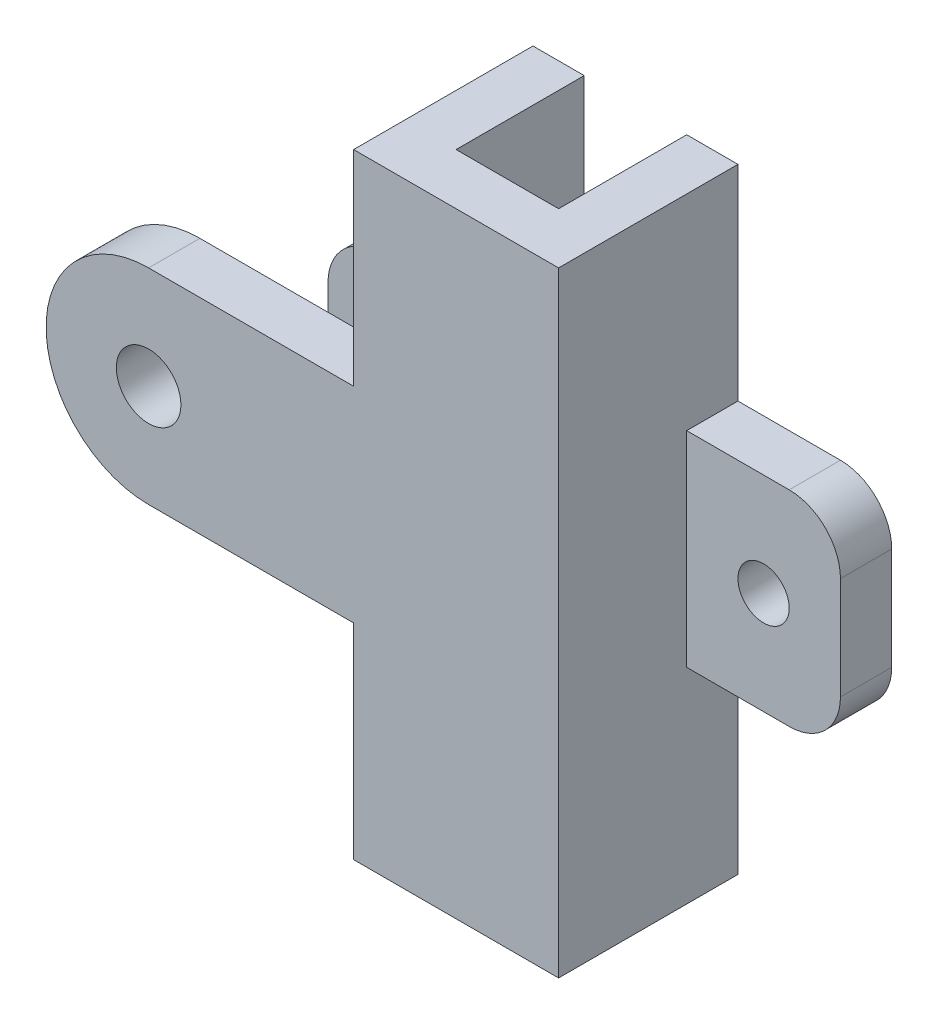
ISO-10303-21;
HEADER;
FILE_DESCRIPTION(('STEP AP214'),'2;1');
FILE_NAME('part.step','',(''),(''),'','','');
FILE_SCHEMA(('AUTOMOTIVE_DESIGN { 1 0 10303 214 1 1 1 1 }'));
ENDSEC;
DATA;
#1=APPLICATION_CONTEXT('core data for automotive mechanical design processes');
#2=APPLICATION_PROTOCOL_DEFINITION('international standard','automotive_design',2000,#1);
#3=PRODUCT_CONTEXT('',#1,'mechanical');
#4=PRODUCT('Part','Part','',(#3));
#5=PRODUCT_RELATED_PRODUCT_CATEGORY('part','',(#4));
#6=PRODUCT_DEFINITION_FORMATION('','',#4);
#7=PRODUCT_DEFINITION_CONTEXT('part definition',#1,'design');
#8=PRODUCT_DEFINITION('design','',#6,#7);
#9=PRODUCT_DEFINITION_SHAPE('','',#8);
#10=(LENGTH_UNIT() NAMED_UNIT(*) SI_UNIT(.MILLI.,.METRE.));
#11=(NAMED_UNIT(*) PLANE_ANGLE_UNIT() SI_UNIT($,.RADIAN.));
#12=(NAMED_UNIT(*) SI_UNIT($,.STERADIAN.) SOLID_ANGLE_UNIT());
#13=UNCERTAINTY_MEASURE_WITH_UNIT(LENGTH_MEASURE(1.E-05),#10,'distance_accuracy_value','');
#14=(GEOMETRIC_REPRESENTATION_CONTEXT(3) GLOBAL_UNCERTAINTY_ASSIGNED_CONTEXT((#13)) GLOBAL_UNIT_ASSIGNED_CONTEXT((#10,
#11,#12)) REPRESENTATION_CONTEXT('',''));
#15=CARTESIAN_POINT('',(0.,0.,0.));
#16=DIRECTION('',(0.,0.,1.));
#17=DIRECTION('',(1.,0.,0.));
#18=AXIS2_PLACEMENT_3D('',#15,#16,#17);
#19=CARTESIAN_POINT('',(25.4,76.2,0.));
#20=DIRECTION('',(-1.,0.,0.));
#21=DIRECTION('',(0.,0.,1.));
#22=AXIS2_PLACEMENT_3D('',#19,#20,#21);
#23=PLANE('',#22);
#24=DIRECTION('',(0.,0.,-1.));
#25=VECTOR('',#24,1.);
#26=CARTESIAN_POINT('',(25.4,25.4,-15.875));
#27=LINE('',#26,#25);
#28=CARTESIAN_POINT('',(25.4,25.4,-15.875));
#29=VERTEX_POINT('',#28);
#30=CARTESIAN_POINT('',(25.4,25.4,-22.225));
#31=VERTEX_POINT('',#30);
#32=EDGE_CURVE('E290',#29,#31,#27,.T.);
#33=ORIENTED_EDGE('',*,*,#32,.F.);
#34=DIRECTION('',(0.,1.,0.));
#35=VECTOR('',#34,1.);
#36=CARTESIAN_POINT('',(25.4,50.8,-15.875));
#37=LINE('',#36,#35);
#38=CARTESIAN_POINT('',(25.4,50.8,-15.875));
#39=VERTEX_POINT('',#38);
#40=EDGE_CURVE('E264',#29,#39,#37,.T.);
#41=ORIENTED_EDGE('',*,*,#40,.T.);
#42=DIRECTION('',(0.,0.,-1.));
#43=VECTOR('',#42,1.);
#44=CARTESIAN_POINT('',(25.4,50.8,-15.875));
#45=LINE('',#44,#43);
#46=CARTESIAN_POINT('',(25.4,50.8,-22.225));
#47=VERTEX_POINT('',#46);
#48=EDGE_CURVE('E280',#39,#47,#45,.T.);
#49=ORIENTED_EDGE('',*,*,#48,.T.);
#50=DIRECTION('',(0.,-1.,0.));
#51=VECTOR('',#50,1.);
#52=CARTESIAN_POINT('',(25.4,76.2,-22.225));
#53=LINE('',#52,#51);
#54=CARTESIAN_POINT('',(25.4,76.2,-22.225));
#55=VERTEX_POINT('',#54);
#56=EDGE_CURVE('E397',#55,#47,#53,.T.);
#57=ORIENTED_EDGE('',*,*,#56,.F.);
#58=DIRECTION('',(0.,0.,-1.));
#59=VECTOR('',#58,1.);
#60=CARTESIAN_POINT('',(25.4,76.2,0.));
#61=LINE('',#60,#59);
#62=CARTESIAN_POINT('',(25.4,76.2,0.));
#63=VERTEX_POINT('',#62);
#64=EDGE_CURVE('E368',#63,#55,#61,.T.);
#65=ORIENTED_EDGE('',*,*,#64,.F.);
#66=DIRECTION('',(0.,-1.,0.));
#67=VECTOR('',#66,1.);
#68=CARTESIAN_POINT('',(25.4,76.2,0.));
#69=LINE('',#68,#67);
#70=CARTESIAN_POINT('',(25.4,0.,0.));
#71=VERTEX_POINT('',#70);
#72=EDGE_CURVE('E401',#63,#71,#69,.T.);
#73=ORIENTED_EDGE('',*,*,#72,.T.);
#74=DIRECTION('',(0.,0.,-1.));
#75=VECTOR('',#74,1.);
#76=CARTESIAN_POINT('',(25.4,0.,0.));
#77=LINE('',#76,#75);
#78=CARTESIAN_POINT('',(25.4,0.,-22.225));
#79=VERTEX_POINT('',#78);
#80=EDGE_CURVE('E349',#71,#79,#77,.T.);
#81=ORIENTED_EDGE('',*,*,#80,.T.);
#82=EDGE_CURVE('E371',#31,#79,#53,.T.);
#83=ORIENTED_EDGE('',*,*,#82,.F.);
#84=EDGE_LOOP('',(#33,#41,#49,#57,#65,#73,#81,#83));
#85=FACE_BOUND('',#84,.T.);
#86=ADVANCED_FACE('F41',(#85),#23,.F.);
#87=CARTESIAN_POINT('',(0.,76.2,-22.225));
#88=DIRECTION('',(0.,0.,-1.));
#89=DIRECTION('',(-1.,0.,0.));
#90=AXIS2_PLACEMENT_3D('',#87,#88,#89);
#91=PLANE('',#90);
#92=DIRECTION('',(0.,-1.,0.));
#93=VECTOR('',#92,1.);
#94=CARTESIAN_POINT('',(44.45,50.8,-22.225));
#95=LINE('',#94,#93);
#96=CARTESIAN_POINT('',(44.45,44.45,-22.225));
#97=VERTEX_POINT('',#96);
#98=CARTESIAN_POINT('',(44.45,31.75,-22.225));
#99=VERTEX_POINT('',#98);
#100=EDGE_CURVE('E284',#97,#99,#95,.T.);
#101=ORIENTED_EDGE('',*,*,#100,.T.);
#102=CARTESIAN_POINT('',(38.1,31.75,-22.225));
#103=DIRECTION('',(0.,0.,-1.));
#104=DIRECTION('',(-1.,0.,0.));
#105=AXIS2_PLACEMENT_3D('',#102,#103,#104);
#106=CIRCLE('',#105,6.35);
#107=CARTESIAN_POINT('',(38.1,25.4,-22.225));
#108=VERTEX_POINT('',#107);
#109=EDGE_CURVE('E432',#99,#108,#106,.T.);
#110=ORIENTED_EDGE('',*,*,#109,.T.);
#111=DIRECTION('',(-1.,0.,0.));
#112=VECTOR('',#111,1.);
#113=CARTESIAN_POINT('',(25.4,25.4,-22.225));
#114=LINE('',#113,#112);
#115=EDGE_CURVE('E269',#108,#31,#114,.T.);
#116=ORIENTED_EDGE('',*,*,#115,.T.);
#117=ORIENTED_EDGE('',*,*,#82,.T.);
#118=DIRECTION('',(1.,0.,0.));
#119=VECTOR('',#118,1.);
#120=CARTESIAN_POINT('',(0.,0.,-22.225));
#121=LINE('',#120,#119);
#122=CARTESIAN_POINT('',(19.05,0.,-22.225));
#123=VERTEX_POINT('',#122);
#124=EDGE_CURVE('E343',#123,#79,#121,.T.);
#125=ORIENTED_EDGE('',*,*,#124,.F.);
#126=DIRECTION('',(0.,-1.,0.));
#127=VECTOR('',#126,1.);
#128=CARTESIAN_POINT('',(19.05,76.2,-22.225));
#129=LINE('',#128,#127);
#130=CARTESIAN_POINT('',(19.05,76.2,-22.225));
#131=VERTEX_POINT('',#130);
#132=EDGE_CURVE('E419',#131,#123,#129,.T.);
#133=ORIENTED_EDGE('',*,*,#132,.F.);
#134=DIRECTION('',(1.,0.,0.));
#135=VECTOR('',#134,1.);
#136=CARTESIAN_POINT('',(0.,76.2,-22.225));
#137=LINE('',#136,#135);
#138=EDGE_CURVE('E344',#131,#55,#137,.T.);
#139=ORIENTED_EDGE('',*,*,#138,.T.);
#140=ORIENTED_EDGE('',*,*,#56,.T.);
#141=DIRECTION('',(1.,0.,0.));
#142=VECTOR('',#141,1.);
#143=CARTESIAN_POINT('',(25.4,50.8,-22.225));
#144=LINE('',#143,#142);
#145=CARTESIAN_POINT('',(38.1,50.8,-22.225));
#146=VERTEX_POINT('',#145);
#147=EDGE_CURVE('E260',#47,#146,#144,.T.);
#148=ORIENTED_EDGE('',*,*,#147,.T.);
#149=CARTESIAN_POINT('',(38.1,44.45,-22.225));
#150=DIRECTION('',(0.,0.,-1.));
#151=DIRECTION('',(-1.,0.,0.));
#152=AXIS2_PLACEMENT_3D('',#149,#150,#151);
#153=CIRCLE('',#152,6.35);
#154=EDGE_CURVE('E429',#146,#97,#153,.T.);
#155=ORIENTED_EDGE('',*,*,#154,.T.);
#156=EDGE_LOOP('',(#101,#110,#116,#117,#125,#133,#139,#140,#148,#155));
#157=FACE_BOUND('',#156,.T.);
#158=CARTESIAN_POINT('',(34.925,38.1,-22.225));
#159=DIRECTION('',(0.,0.,-1.));
#160=DIRECTION('',(-1.,0.,0.));
#161=AXIS2_PLACEMENT_3D('',#158,#159,#160);
#162=CIRCLE('',#161,3.175);
#163=CARTESIAN_POINT('',(31.75,38.1,-22.225));
#164=VERTEX_POINT('',#163);
#165=EDGE_CURVE('E254',#164,#164,#162,.T.);
#166=ORIENTED_EDGE('',*,*,#165,.F.);
#167=EDGE_LOOP('',(#166));
#168=FACE_BOUND('',#167,.T.);
#169=ADVANCED_FACE('F540',(#157,#168),#91,.T.);
#170=CARTESIAN_POINT('',(19.05,76.2,0.));
#171=DIRECTION('',(1.,0.,0.));
#172=DIRECTION('',(0.,0.,-1.));
#173=AXIS2_PLACEMENT_3D('',#170,#171,#172);
#174=PLANE('',#173);
#175=DIRECTION('',(0.,0.,1.));
#176=VECTOR('',#175,1.);
#177=CARTESIAN_POINT('',(19.05,0.,0.));
#178=LINE('',#177,#176);
#179=CARTESIAN_POINT('',(19.05,0.,-6.35));
#180=VERTEX_POINT('',#179);
#181=EDGE_CURVE('E375',#123,#180,#178,.T.);
#182=ORIENTED_EDGE('',*,*,#181,.T.);
#183=DIRECTION('',(0.,-1.,0.));
#184=VECTOR('',#183,1.);
#185=CARTESIAN_POINT('',(19.05,76.2,-6.35));
#186=LINE('',#185,#184);
#187=CARTESIAN_POINT('',(19.05,76.2,-6.35));
#188=VERTEX_POINT('',#187);
#189=EDGE_CURVE('E416',#188,#180,#186,.T.);
#190=ORIENTED_EDGE('',*,*,#189,.F.);
#191=DIRECTION('',(0.,0.,1.));
#192=VECTOR('',#191,1.);
#193=CARTESIAN_POINT('',(19.05,76.2,0.));
#194=LINE('',#193,#192);
#195=EDGE_CURVE('E348',#131,#188,#194,.T.);
#196=ORIENTED_EDGE('',*,*,#195,.F.);
#197=ORIENTED_EDGE('',*,*,#132,.T.);
#198=EDGE_LOOP('',(#182,#190,#196,#197));
#199=FACE_BOUND('',#198,.T.);
#200=ADVANCED_FACE('F545',(#199),#174,.F.);
#201=CARTESIAN_POINT('',(0.,76.2,-6.35));
#202=DIRECTION('',(0.,0.,-1.));
#203=DIRECTION('',(-1.,0.,0.));
#204=AXIS2_PLACEMENT_3D('',#201,#202,#203);
#205=PLANE('',#204);
#206=ORIENTED_EDGE('',*,*,#189,.T.);
#207=DIRECTION('',(1.,0.,0.));
#208=VECTOR('',#207,1.);
#209=CARTESIAN_POINT('',(0.,0.,-6.35));
#210=LINE('',#209,#208);
#211=CARTESIAN_POINT('',(6.35,0.,-6.35));
#212=VERTEX_POINT('',#211);
#213=EDGE_CURVE('E379',#212,#180,#210,.T.);
#214=ORIENTED_EDGE('',*,*,#213,.F.);
#215=DIRECTION('',(0.,-1.,0.));
#216=VECTOR('',#215,1.);
#217=CARTESIAN_POINT('',(6.35,76.2,-6.35));
#218=LINE('',#217,#216);
#219=CARTESIAN_POINT('',(6.35,76.2,-6.35));
#220=VERTEX_POINT('',#219);
#221=EDGE_CURVE('E413',#220,#212,#218,.T.);
#222=ORIENTED_EDGE('',*,*,#221,.F.);
#223=DIRECTION('',(1.,0.,0.));
#224=VECTOR('',#223,1.);
#225=CARTESIAN_POINT('',(0.,76.2,-6.35));
#226=LINE('',#225,#224);
#227=EDGE_CURVE('E353',#220,#188,#226,.T.);
#228=ORIENTED_EDGE('',*,*,#227,.T.);
#229=EDGE_LOOP('',(#206,#214,#222,#228));
#230=FACE_BOUND('',#229,.T.);
#231=ADVANCED_FACE('F558',(#230),#205,.T.);
#232=CARTESIAN_POINT('',(6.35,76.2,0.));
#233=DIRECTION('',(1.,0.,0.));
#234=DIRECTION('',(0.,0.,-1.));
#235=AXIS2_PLACEMENT_3D('',#232,#233,#234);
#236=PLANE('',#235);
#237=DIRECTION('',(0.,0.,1.));
#238=VECTOR('',#237,1.);
#239=CARTESIAN_POINT('',(6.35,0.,0.));
#240=LINE('',#239,#238);
#241=CARTESIAN_POINT('',(6.35,0.,-22.225));
#242=VERTEX_POINT('',#241);
#243=EDGE_CURVE('E383',#242,#212,#240,.T.);
#244=ORIENTED_EDGE('',*,*,#243,.F.);
#245=DIRECTION('',(0.,-1.,0.));
#246=VECTOR('',#245,1.);
#247=CARTESIAN_POINT('',(6.35,76.2,-22.225));
#248=LINE('',#247,#246);
#249=CARTESIAN_POINT('',(6.35,76.2,-22.225));
#250=VERTEX_POINT('',#249);
#251=EDGE_CURVE('E410',#250,#242,#248,.T.);
#252=ORIENTED_EDGE('',*,*,#251,.F.);
#253=DIRECTION('',(0.,0.,1.));
#254=VECTOR('',#253,1.);
#255=CARTESIAN_POINT('',(6.35,76.2,0.));
#256=LINE('',#255,#254);
#257=EDGE_CURVE('E357',#250,#220,#256,.T.);
#258=ORIENTED_EDGE('',*,*,#257,.T.);
#259=ORIENTED_EDGE('',*,*,#221,.T.);
#260=EDGE_LOOP('',(#244,#252,#258,#259));
#261=FACE_BOUND('',#260,.T.);
#262=ADVANCED_FACE('F555',(#261),#236,.T.);
#263=DIRECTION('',(-1.,0.,0.));
#264=VECTOR('',#263,1.);
#265=CARTESIAN_POINT('',(0.,25.4,-22.225));
#266=LINE('',#265,#264);
#267=CARTESIAN_POINT('',(0.,25.4,-22.225));
#268=VERTEX_POINT('',#267);
#269=CARTESIAN_POINT('',(-12.7,25.4,-22.225));
#270=VERTEX_POINT('',#269);
#271=EDGE_CURVE('E208',#268,#270,#266,.T.);
#272=ORIENTED_EDGE('',*,*,#271,.T.);
#273=CARTESIAN_POINT('',(-12.7,31.75,-22.225));
#274=DIRECTION('',(0.,0.,-1.));
#275=DIRECTION('',(-1.,0.,0.));
#276=AXIS2_PLACEMENT_3D('',#273,#274,#275);
#277=CIRCLE('',#276,6.35);
#278=CARTESIAN_POINT('',(-19.05,31.75,-22.225));
#279=VERTEX_POINT('',#278);
#280=EDGE_CURVE('E453',#270,#279,#277,.T.);
#281=ORIENTED_EDGE('',*,*,#280,.T.);
#282=DIRECTION('',(0.,1.,0.));
#283=VECTOR('',#282,1.);
#284=CARTESIAN_POINT('',(-19.05,50.8,-22.225));
#285=LINE('',#284,#283);
#286=CARTESIAN_POINT('',(-19.05,44.45,-22.225));
#287=VERTEX_POINT('',#286);
#288=EDGE_CURVE('E236',#279,#287,#285,.T.);
#289=ORIENTED_EDGE('',*,*,#288,.T.);
#290=CARTESIAN_POINT('',(-12.7,44.45,-22.225));
#291=DIRECTION('',(0.,0.,-1.));
#292=DIRECTION('',(-1.,0.,0.));
#293=AXIS2_PLACEMENT_3D('',#290,#291,#292);
#294=CIRCLE('',#293,6.35);
#295=CARTESIAN_POINT('',(-12.7,50.8,-22.225));
#296=VERTEX_POINT('',#295);
#297=EDGE_CURVE('E450',#287,#296,#294,.T.);
#298=ORIENTED_EDGE('',*,*,#297,.T.);
#299=DIRECTION('',(1.,0.,0.));
#300=VECTOR('',#299,1.);
#301=CARTESIAN_POINT('',(0.,50.8,-22.225));
#302=LINE('',#301,#300);
#303=CARTESIAN_POINT('',(0.,50.8,-22.225));
#304=VERTEX_POINT('',#303);
#305=EDGE_CURVE('E242',#296,#304,#302,.T.);
#306=ORIENTED_EDGE('',*,*,#305,.T.);
#307=DIRECTION('',(0.,-1.,0.));
#308=VECTOR('',#307,1.);
#309=CARTESIAN_POINT('',(0.,76.2,-22.225));
#310=LINE('',#309,#308);
#311=CARTESIAN_POINT('',(0.,76.2,-22.225));
#312=VERTEX_POINT('',#311);
#313=EDGE_CURVE('E215',#312,#304,#310,.T.);
#314=ORIENTED_EDGE('',*,*,#313,.F.);
#315=EDGE_CURVE('E350',#312,#250,#137,.T.);
#316=ORIENTED_EDGE('',*,*,#315,.T.);
#317=ORIENTED_EDGE('',*,*,#251,.T.);
#318=CARTESIAN_POINT('',(0.,0.,-22.225));
#319=VERTEX_POINT('',#318);
#320=EDGE_CURVE('E210',#319,#242,#121,.T.);
#321=ORIENTED_EDGE('',*,*,#320,.F.);
#322=EDGE_CURVE('E203',#268,#319,#310,.T.);
#323=ORIENTED_EDGE('',*,*,#322,.F.);
#324=EDGE_LOOP('',(#272,#281,#289,#298,#306,#314,#316,#317,#321,#323));
#325=FACE_BOUND('',#324,.T.);
#326=CARTESIAN_POINT('',(-9.52500000000001,38.1,-22.225));
#327=DIRECTION('',(0.,0.,-1.));
#328=DIRECTION('',(1.,0.,0.));
#329=AXIS2_PLACEMENT_3D('',#326,#327,#328);
#330=CIRCLE('',#329,3.175);
#331=CARTESIAN_POINT('',(-6.35000000000001,38.1,-22.225));
#332=VERTEX_POINT('',#331);
#333=EDGE_CURVE('E245',#332,#332,#330,.T.);
#334=ORIENTED_EDGE('',*,*,#333,.F.);
#335=EDGE_LOOP('',(#334));
#336=FACE_BOUND('',#335,.T.);
#337=ADVANCED_FACE('F205',(#325,#336),#91,.T.);
#338=CARTESIAN_POINT('',(0.,76.2,0.));
#339=DIRECTION('',(-1.,0.,0.));
#340=DIRECTION('',(0.,0.,1.));
#341=AXIS2_PLACEMENT_3D('',#338,#339,#340);
#342=PLANE('',#341);
#343=DIRECTION('',(0.,0.,-1.));
#344=VECTOR('',#343,1.);
#345=CARTESIAN_POINT('',(0.,50.8,-15.875));
#346=LINE('',#345,#344);
#347=CARTESIAN_POINT('',(0.,50.8,-15.875));
#348=VERTEX_POINT('',#347);
#349=EDGE_CURVE('E228',#348,#304,#346,.T.);
#350=ORIENTED_EDGE('',*,*,#349,.F.);
#351=DIRECTION('',(0.,-1.,0.));
#352=VECTOR('',#351,1.);
#353=CARTESIAN_POINT('',(0.,50.8,-15.875));
#354=LINE('',#353,#352);
#355=CARTESIAN_POINT('',(0.,25.4,-15.875));
#356=VERTEX_POINT('',#355);
#357=EDGE_CURVE('E223',#348,#356,#354,.T.);
#358=ORIENTED_EDGE('',*,*,#357,.T.);
#359=DIRECTION('',(0.,0.,-1.));
#360=VECTOR('',#359,1.);
#361=CARTESIAN_POINT('',(0.,25.4,-15.875));
#362=LINE('',#361,#360);
#363=EDGE_CURVE('E219',#356,#268,#362,.T.);
#364=ORIENTED_EDGE('',*,*,#363,.T.);
#365=ORIENTED_EDGE('',*,*,#322,.T.);
#366=DIRECTION('',(0.,0.,-1.));
#367=VECTOR('',#366,1.);
#368=CARTESIAN_POINT('',(0.,0.,0.));
#369=LINE('',#368,#367);
#370=CARTESIAN_POINT('',(0.,0.,0.));
#371=VERTEX_POINT('',#370);
#372=EDGE_CURVE('E387',#371,#319,#369,.T.);
#373=ORIENTED_EDGE('',*,*,#372,.F.);
#374=DIRECTION('',(0.,-1.,0.));
#375=VECTOR('',#374,1.);
#376=CARTESIAN_POINT('',(0.,76.2,0.));
#377=LINE('',#376,#375);
#378=CARTESIAN_POINT('',(0.,25.4,0.));
#379=VERTEX_POINT('',#378);
#380=EDGE_CURVE('E404',#379,#371,#377,.T.);
#381=ORIENTED_EDGE('',*,*,#380,.F.);
#382=DIRECTION('',(0.,0.,1.));
#383=VECTOR('',#382,1.);
#384=CARTESIAN_POINT('',(0.,25.4,0.));
#385=LINE('',#384,#383);
#386=CARTESIAN_POINT('',(0.,25.4,-6.35));
#387=VERTEX_POINT('',#386);
#388=EDGE_CURVE('E339',#387,#379,#385,.T.);
#389=ORIENTED_EDGE('',*,*,#388,.F.);
#390=DIRECTION('',(0.,-1.,0.));
#391=VECTOR('',#390,1.);
#392=CARTESIAN_POINT('',(0.,76.2,-6.35));
#393=LINE('',#392,#391);
#394=CARTESIAN_POINT('',(0.,50.8,-6.35));
#395=VERTEX_POINT('',#394);
#396=EDGE_CURVE('E330',#395,#387,#393,.T.);
#397=ORIENTED_EDGE('',*,*,#396,.F.);
#398=DIRECTION('',(0.,0.,-1.));
#399=VECTOR('',#398,1.);
#400=CARTESIAN_POINT('',(0.,50.8,0.));
#401=LINE('',#400,#399);
#402=CARTESIAN_POINT('',(0.,50.8,0.));
#403=VERTEX_POINT('',#402);
#404=EDGE_CURVE('E336',#403,#395,#401,.T.);
#405=ORIENTED_EDGE('',*,*,#404,.F.);
#406=CARTESIAN_POINT('',(0.,76.2,0.));
#407=VERTEX_POINT('',#406);
#408=EDGE_CURVE('E216',#407,#403,#377,.T.);
#409=ORIENTED_EDGE('',*,*,#408,.F.);
#410=DIRECTION('',(0.,0.,-1.));
#411=VECTOR('',#410,1.);
#412=CARTESIAN_POINT('',(0.,76.2,0.));
#413=LINE('',#412,#411);
#414=EDGE_CURVE('E361',#407,#312,#413,.T.);
#415=ORIENTED_EDGE('',*,*,#414,.T.);
#416=ORIENTED_EDGE('',*,*,#313,.T.);
#417=EDGE_LOOP('',(#350,#358,#364,#365,#373,#381,#389,#397,#405,#409,#415,#416));
#418=FACE_BOUND('',#417,.T.);
#419=ADVANCED_FACE('F221',(#418),#342,.T.);
#420=CARTESIAN_POINT('',(0.,76.2,0.));
#421=DIRECTION('',(0.,0.,-1.));
#422=DIRECTION('',(-1.,0.,0.));
#423=AXIS2_PLACEMENT_3D('',#420,#421,#422);
#424=PLANE('',#423);
#425=DIRECTION('',(1.,0.,0.));
#426=VECTOR('',#425,1.);
#427=CARTESIAN_POINT('',(0.,0.,0.));
#428=LINE('',#427,#426);
#429=EDGE_CURVE('E390',#371,#71,#428,.T.);
#430=ORIENTED_EDGE('',*,*,#429,.T.);
#431=ORIENTED_EDGE('',*,*,#72,.F.);
#432=DIRECTION('',(1.,0.,0.));
#433=VECTOR('',#432,1.);
#434=CARTESIAN_POINT('',(0.,76.2,0.));
#435=LINE('',#434,#433);
#436=EDGE_CURVE('E365',#407,#63,#435,.T.);
#437=ORIENTED_EDGE('',*,*,#436,.F.);
#438=ORIENTED_EDGE('',*,*,#408,.T.);
#439=DIRECTION('',(-1.,0.,0.));
#440=VECTOR('',#439,1.);
#441=CARTESIAN_POINT('',(12.7,50.8,0.));
#442=LINE('',#441,#440);
#443=CARTESIAN_POINT('',(-25.4,50.8,0.));
#444=VERTEX_POINT('',#443);
#445=EDGE_CURVE('E302',#403,#444,#442,.T.);
#446=ORIENTED_EDGE('',*,*,#445,.T.);
#447=CARTESIAN_POINT('',(-25.4,38.1,0.));
#448=DIRECTION('',(0.,0.,1.));
#449=DIRECTION('',(1.,0.,0.));
#450=AXIS2_PLACEMENT_3D('',#447,#448,#449);
#451=CIRCLE('',#450,12.7);
#452=CARTESIAN_POINT('',(-25.4,25.4,0.));
#453=VERTEX_POINT('',#452);
#454=EDGE_CURVE('E321',#444,#453,#451,.T.);
#455=ORIENTED_EDGE('',*,*,#454,.T.);
#456=DIRECTION('',(1.,0.,0.));
#457=VECTOR('',#456,1.);
#458=CARTESIAN_POINT('',(-25.4,25.4,0.));
#459=LINE('',#458,#457);
#460=EDGE_CURVE('E310',#453,#379,#459,.T.);
#461=ORIENTED_EDGE('',*,*,#460,.T.);
#462=ORIENTED_EDGE('',*,*,#380,.T.);
#463=EDGE_LOOP('',(#430,#431,#437,#438,#446,#455,#461,#462));
#464=FACE_BOUND('',#463,.T.);
#465=CARTESIAN_POINT('',(-25.4,38.1,0.));
#466=DIRECTION('',(0.,0.,1.));
#467=DIRECTION('',(1.,0.,0.));
#468=AXIS2_PLACEMENT_3D('',#465,#466,#467);
#469=CIRCLE('',#468,4.0005);
#470=CARTESIAN_POINT('',(-21.3995,38.1,0.));
#471=VERTEX_POINT('',#470);
#472=EDGE_CURVE('E294',#471,#471,#469,.T.);
#473=ORIENTED_EDGE('',*,*,#472,.F.);
#474=EDGE_LOOP('',(#473));
#475=FACE_BOUND('',#474,.T.);
#476=ADVANCED_FACE('F493',(#464,#475),#424,.F.);
#477=CARTESIAN_POINT('',(0.,76.2,0.));
#478=DIRECTION('',(0.,1.,0.));
#479=DIRECTION('',(0.,0.,1.));
#480=AXIS2_PLACEMENT_3D('',#477,#478,#479);
#481=PLANE('',#480);
#482=ORIENTED_EDGE('',*,*,#138,.F.);
#483=ORIENTED_EDGE('',*,*,#195,.T.);
#484=ORIENTED_EDGE('',*,*,#227,.F.);
#485=ORIENTED_EDGE('',*,*,#257,.F.);
#486=ORIENTED_EDGE('',*,*,#315,.F.);
#487=ORIENTED_EDGE('',*,*,#414,.F.);
#488=ORIENTED_EDGE('',*,*,#436,.T.);
#489=ORIENTED_EDGE('',*,*,#64,.T.);
#490=EDGE_LOOP('',(#482,#483,#484,#485,#486,#487,#488,#489));
#491=FACE_BOUND('',#490,.T.);
#492=ADVANCED_FACE('F513',(#491),#481,.T.);
#493=CARTESIAN_POINT('',(0.,0.,0.));
#494=DIRECTION('',(0.,1.,0.));
#495=DIRECTION('',(0.,0.,1.));
#496=AXIS2_PLACEMENT_3D('',#493,#494,#495);
#497=PLANE('',#496);
#498=ORIENTED_EDGE('',*,*,#124,.T.);
#499=ORIENTED_EDGE('',*,*,#80,.F.);
#500=ORIENTED_EDGE('',*,*,#429,.F.);
#501=ORIENTED_EDGE('',*,*,#372,.T.);
#502=ORIENTED_EDGE('',*,*,#320,.T.);
#503=ORIENTED_EDGE('',*,*,#243,.T.);
#504=ORIENTED_EDGE('',*,*,#213,.T.);
#505=ORIENTED_EDGE('',*,*,#181,.F.);
#506=EDGE_LOOP('',(#498,#499,#500,#501,#502,#503,#504,#505));
#507=FACE_BOUND('',#506,.T.);
#508=ADVANCED_FACE('F500',(#507),#497,.F.);
#509=CARTESIAN_POINT('',(-25.4,25.4,-6.35));
#510=DIRECTION('',(0.,-1.,0.));
#511=DIRECTION('',(1.,0.,0.));
#512=AXIS2_PLACEMENT_3D('',#509,#510,#511);
#513=PLANE('',#512);
#514=DIRECTION('',(1.,0.,0.));
#515=VECTOR('',#514,1.);
#516=CARTESIAN_POINT('',(-25.4,25.4,-6.35));
#517=LINE('',#516,#515);
#518=CARTESIAN_POINT('',(-25.4,25.4,-6.35));
#519=VERTEX_POINT('',#518);
#520=EDGE_CURVE('E314',#519,#387,#517,.T.);
#521=ORIENTED_EDGE('',*,*,#520,.T.);
#522=ORIENTED_EDGE('',*,*,#388,.T.);
#523=ORIENTED_EDGE('',*,*,#460,.F.);
#524=DIRECTION('',(0.,0.,1.));
#525=VECTOR('',#524,1.);
#526=CARTESIAN_POINT('',(-25.4,25.4,-6.35));
#527=LINE('',#526,#525);
#528=EDGE_CURVE('E327',#519,#453,#527,.T.);
#529=ORIENTED_EDGE('',*,*,#528,.F.);
#530=EDGE_LOOP('',(#521,#522,#523,#529));
#531=FACE_BOUND('',#530,.T.);
#532=ADVANCED_FACE('F529',(#531),#513,.T.);
#533=CARTESIAN_POINT('',(-25.4,38.1,-6.35));
#534=DIRECTION('',(0.,0.,1.));
#535=DIRECTION('',(1.,0.,0.));
#536=AXIS2_PLACEMENT_3D('',#533,#534,#535);
#537=CYLINDRICAL_SURFACE('',#536,12.7);
#538=ORIENTED_EDGE('',*,*,#454,.F.);
#539=DIRECTION('',(0.,0.,1.));
#540=VECTOR('',#539,1.);
#541=CARTESIAN_POINT('',(-25.4,50.8,-6.35));
#542=LINE('',#541,#540);
#543=CARTESIAN_POINT('',(-25.4,50.8,-6.35));
#544=VERTEX_POINT('',#543);
#545=EDGE_CURVE('E318',#544,#444,#542,.T.);
#546=ORIENTED_EDGE('',*,*,#545,.F.);
#547=CARTESIAN_POINT('',(-25.4,38.1,-6.35));
#548=DIRECTION('',(0.,0.,1.));
#549=DIRECTION('',(1.,0.,0.));
#550=AXIS2_PLACEMENT_3D('',#547,#548,#549);
#551=CIRCLE('',#550,12.7);
#552=EDGE_CURVE('E309',#544,#519,#551,.T.);
#553=ORIENTED_EDGE('',*,*,#552,.T.);
#554=ORIENTED_EDGE('',*,*,#528,.T.);
#555=EDGE_LOOP('',(#538,#546,#553,#554));
#556=FACE_BOUND('',#555,.T.);
#557=ADVANCED_FACE('F527',(#556),#537,.T.);
#558=CARTESIAN_POINT('',(12.7,50.8,-6.35));
#559=DIRECTION('',(0.,1.,0.));
#560=DIRECTION('',(-1.,0.,0.));
#561=AXIS2_PLACEMENT_3D('',#558,#559,#560);
#562=PLANE('',#561);
#563=ORIENTED_EDGE('',*,*,#445,.F.);
#564=ORIENTED_EDGE('',*,*,#404,.T.);
#565=DIRECTION('',(-1.,0.,0.));
#566=VECTOR('',#565,1.);
#567=CARTESIAN_POINT('',(12.7,50.8,-6.35));
#568=LINE('',#567,#566);
#569=EDGE_CURVE('E306',#395,#544,#568,.T.);
#570=ORIENTED_EDGE('',*,*,#569,.T.);
#571=ORIENTED_EDGE('',*,*,#545,.T.);
#572=EDGE_LOOP('',(#563,#564,#570,#571));
#573=FACE_BOUND('',#572,.T.);
#574=ADVANCED_FACE('F519',(#573),#562,.T.);
#575=CARTESIAN_POINT('',(12.7,38.1,-6.35));
#576=DIRECTION('',(0.,0.,-1.));
#577=DIRECTION('',(-1.,0.,0.));
#578=AXIS2_PLACEMENT_3D('',#575,#576,#577);
#579=PLANE('',#578);
#580=CARTESIAN_POINT('',(-25.4,38.1,-6.35));
#581=DIRECTION('',(0.,0.,1.));
#582=DIRECTION('',(1.,0.,0.));
#583=AXIS2_PLACEMENT_3D('',#580,#581,#582);
#584=CIRCLE('',#583,4.0005);
#585=CARTESIAN_POINT('',(-21.3995,38.1,-6.35));
#586=VERTEX_POINT('',#585);
#587=EDGE_CURVE('E298',#586,#586,#584,.T.);
#588=ORIENTED_EDGE('',*,*,#587,.T.);
#589=EDGE_LOOP('',(#588));
#590=FACE_BOUND('',#589,.T.);
#591=ORIENTED_EDGE('',*,*,#569,.F.);
#592=ORIENTED_EDGE('',*,*,#396,.T.);
#593=ORIENTED_EDGE('',*,*,#520,.F.);
#594=ORIENTED_EDGE('',*,*,#552,.F.);
#595=EDGE_LOOP('',(#591,#592,#593,#594));
#596=FACE_BOUND('',#595,.T.);
#597=ADVANCED_FACE('F523',(#590,#596),#579,.T.);
#598=CARTESIAN_POINT('',(-25.4,38.1,-6.35));
#599=DIRECTION('',(0.,0.,1.));
#600=DIRECTION('',(1.,0.,0.));
#601=AXIS2_PLACEMENT_3D('',#598,#599,#600);
#602=CYLINDRICAL_SURFACE('',#601,4.0005);
#603=ORIENTED_EDGE('',*,*,#587,.F.);
#604=EDGE_LOOP('',(#603));
#605=FACE_BOUND('',#604,.T.);
#606=ORIENTED_EDGE('',*,*,#472,.T.);
#607=EDGE_LOOP('',(#606));
#608=FACE_BOUND('',#607,.T.);
#609=ADVANCED_FACE('F674',(#605,#608),#602,.F.);
#610=CARTESIAN_POINT('',(25.4,25.4,-15.875));
#611=DIRECTION('',(0.,-1.,0.));
#612=DIRECTION('',(0.,0.,-1.));
#613=AXIS2_PLACEMENT_3D('',#610,#611,#612);
#614=PLANE('',#613);
#615=ORIENTED_EDGE('',*,*,#115,.F.);
#616=DIRECTION('',(0.,0.,-1.));
#617=VECTOR('',#616,1.);
#618=CARTESIAN_POINT('',(38.1,25.4,-15.875));
#619=LINE('',#618,#617);
#620=CARTESIAN_POINT('',(38.1,25.4,-15.875));
#621=VERTEX_POINT('',#620);
#622=EDGE_CURVE('E435',#108,#621,#619,.F.);
#623=ORIENTED_EDGE('',*,*,#622,.T.);
#624=DIRECTION('',(-1.,0.,0.));
#625=VECTOR('',#624,1.);
#626=CARTESIAN_POINT('',(25.4,25.4,-15.875));
#627=LINE('',#626,#625);
#628=EDGE_CURVE('E277',#621,#29,#627,.T.);
#629=ORIENTED_EDGE('',*,*,#628,.T.);
#630=ORIENTED_EDGE('',*,*,#32,.T.);
#631=EDGE_LOOP('',(#615,#623,#629,#630));
#632=FACE_BOUND('',#631,.T.);
#633=ADVANCED_FACE('F664',(#632),#614,.T.);
#634=CARTESIAN_POINT('',(44.45,50.8,-15.875));
#635=DIRECTION('',(1.,0.,0.));
#636=DIRECTION('',(0.,0.,-1.));
#637=AXIS2_PLACEMENT_3D('',#634,#635,#636);
#638=PLANE('',#637);
#639=DIRECTION('',(0.,-1.,0.));
#640=VECTOR('',#639,1.);
#641=CARTESIAN_POINT('',(44.45,50.8,-15.875));
#642=LINE('',#641,#640);
#643=CARTESIAN_POINT('',(44.45,44.45,-15.875));
#644=VERTEX_POINT('',#643);
#645=CARTESIAN_POINT('',(44.45,31.75,-15.875));
#646=VERTEX_POINT('',#645);
#647=EDGE_CURVE('E273',#644,#646,#642,.T.);
#648=ORIENTED_EDGE('',*,*,#647,.T.);
#649=DIRECTION('',(0.,0.,-1.));
#650=VECTOR('',#649,1.);
#651=CARTESIAN_POINT('',(44.45,31.75,-15.875));
#652=LINE('',#651,#650);
#653=EDGE_CURVE('E425',#646,#99,#652,.T.);
#654=ORIENTED_EDGE('',*,*,#653,.T.);
#655=ORIENTED_EDGE('',*,*,#100,.F.);
#656=DIRECTION('',(0.,0.,-1.));
#657=VECTOR('',#656,1.);
#658=CARTESIAN_POINT('',(44.45,44.45,-15.875));
#659=LINE('',#658,#657);
#660=EDGE_CURVE('E422',#97,#644,#659,.F.);
#661=ORIENTED_EDGE('',*,*,#660,.T.);
#662=EDGE_LOOP('',(#648,#654,#655,#661));
#663=FACE_BOUND('',#662,.T.);
#664=ADVANCED_FACE('F654',(#663),#638,.T.);
#665=CARTESIAN_POINT('',(25.4,50.8,-15.875));
#666=DIRECTION('',(0.,1.,0.));
#667=DIRECTION('',(0.,0.,1.));
#668=AXIS2_PLACEMENT_3D('',#665,#666,#667);
#669=PLANE('',#668);
#670=DIRECTION('',(1.,0.,0.));
#671=VECTOR('',#670,1.);
#672=CARTESIAN_POINT('',(25.4,50.8,-15.875));
#673=LINE('',#672,#671);
#674=CARTESIAN_POINT('',(38.1,50.8,-15.875));
#675=VERTEX_POINT('',#674);
#676=EDGE_CURVE('E268',#39,#675,#673,.T.);
#677=ORIENTED_EDGE('',*,*,#676,.T.);
#678=DIRECTION('',(0.,0.,-1.));
#679=VECTOR('',#678,1.);
#680=CARTESIAN_POINT('',(38.1,50.8,-15.875));
#681=LINE('',#680,#679);
#682=EDGE_CURVE('E444',#675,#146,#681,.T.);
#683=ORIENTED_EDGE('',*,*,#682,.T.);
#684=ORIENTED_EDGE('',*,*,#147,.F.);
#685=ORIENTED_EDGE('',*,*,#48,.F.);
#686=EDGE_LOOP('',(#677,#683,#684,#685));
#687=FACE_BOUND('',#686,.T.);
#688=ADVANCED_FACE('F644',(#687),#669,.T.);
#689=CARTESIAN_POINT('',(0.,0.,-15.875));
#690=DIRECTION('',(0.,0.,1.));
#691=DIRECTION('',(1.,0.,0.));
#692=AXIS2_PLACEMENT_3D('',#689,#690,#691);
#693=PLANE('',#692);
#694=CARTESIAN_POINT('',(34.925,38.1,-15.875));
#695=DIRECTION('',(0.,0.,-1.));
#696=DIRECTION('',(-1.,0.,0.));
#697=AXIS2_PLACEMENT_3D('',#694,#695,#696);
#698=CIRCLE('',#697,3.175);
#699=CARTESIAN_POINT('',(31.75,38.1,-15.875));
#700=VERTEX_POINT('',#699);
#701=EDGE_CURVE('E256',#700,#700,#698,.T.);
#702=ORIENTED_EDGE('',*,*,#701,.T.);
#703=EDGE_LOOP('',(#702));
#704=FACE_BOUND('',#703,.T.);
#705=ORIENTED_EDGE('',*,*,#628,.F.);
#706=CARTESIAN_POINT('',(38.1,31.75,-15.875));
#707=DIRECTION('',(0.,0.,1.));
#708=DIRECTION('',(1.,0.,0.));
#709=AXIS2_PLACEMENT_3D('',#706,#707,#708);
#710=CIRCLE('',#709,6.35);
#711=EDGE_CURVE('E441',#621,#646,#710,.T.);
#712=ORIENTED_EDGE('',*,*,#711,.T.);
#713=ORIENTED_EDGE('',*,*,#647,.F.);
#714=CARTESIAN_POINT('',(38.1,44.45,-15.875));
#715=DIRECTION('',(0.,0.,1.));
#716=DIRECTION('',(1.,0.,0.));
#717=AXIS2_PLACEMENT_3D('',#714,#715,#716);
#718=CIRCLE('',#717,6.35);
#719=EDGE_CURVE('E438',#644,#675,#718,.T.);
#720=ORIENTED_EDGE('',*,*,#719,.T.);
#721=ORIENTED_EDGE('',*,*,#676,.F.);
#722=ORIENTED_EDGE('',*,*,#40,.F.);
#723=EDGE_LOOP('',(#705,#712,#713,#720,#721,#722));
#724=FACE_BOUND('',#723,.T.);
#725=ADVANCED_FACE('F639',(#704,#724),#693,.T.);
#726=CARTESIAN_POINT('',(34.925,38.1,-15.875));
#727=DIRECTION('',(0.,0.,-1.));
#728=DIRECTION('',(-1.,0.,0.));
#729=AXIS2_PLACEMENT_3D('',#726,#727,#728);
#730=CYLINDRICAL_SURFACE('',#729,3.175);
#731=ORIENTED_EDGE('',*,*,#701,.F.);
#732=EDGE_LOOP('',(#731));
#733=FACE_BOUND('',#732,.T.);
#734=ORIENTED_EDGE('',*,*,#165,.T.);
#735=EDGE_LOOP('',(#734));
#736=FACE_BOUND('',#735,.T.);
#737=ADVANCED_FACE('F632',(#733,#736),#730,.F.);
#738=CARTESIAN_POINT('',(0.,50.8,-15.875));
#739=DIRECTION('',(0.,1.,0.));
#740=DIRECTION('',(0.,0.,1.));
#741=AXIS2_PLACEMENT_3D('',#738,#739,#740);
#742=PLANE('',#741);
#743=ORIENTED_EDGE('',*,*,#305,.F.);
#744=DIRECTION('',(0.,0.,-1.));
#745=VECTOR('',#744,1.);
#746=CARTESIAN_POINT('',(-12.7,50.8,-15.875));
#747=LINE('',#746,#745);
#748=CARTESIAN_POINT('',(-12.7,50.8,-15.875));
#749=VERTEX_POINT('',#748);
#750=EDGE_CURVE('E11',#296,#749,#747,.F.);
#751=ORIENTED_EDGE('',*,*,#750,.T.);
#752=DIRECTION('',(1.,0.,0.));
#753=VECTOR('',#752,1.);
#754=CARTESIAN_POINT('',(0.,50.8,-15.875));
#755=LINE('',#754,#753);
#756=EDGE_CURVE('E229',#749,#348,#755,.T.);
#757=ORIENTED_EDGE('',*,*,#756,.T.);
#758=ORIENTED_EDGE('',*,*,#349,.T.);
#759=EDGE_LOOP('',(#743,#751,#757,#758));
#760=FACE_BOUND('',#759,.T.);
#761=ADVANCED_FACE('F479',(#760),#742,.T.);
#762=CARTESIAN_POINT('',(-19.05,50.8,-15.875));
#763=DIRECTION('',(-1.,0.,0.));
#764=DIRECTION('',(0.,0.,1.));
#765=AXIS2_PLACEMENT_3D('',#762,#763,#764);
#766=PLANE('',#765);
#767=ORIENTED_EDGE('',*,*,#288,.F.);
#768=DIRECTION('',(0.,0.,-1.));
#769=VECTOR('',#768,1.);
#770=CARTESIAN_POINT('',(-19.05,31.75,-15.875));
#771=LINE('',#770,#769);
#772=CARTESIAN_POINT('',(-19.05,31.75,-15.875));
#773=VERTEX_POINT('',#772);
#774=EDGE_CURVE('E460',#279,#773,#771,.F.);
#775=ORIENTED_EDGE('',*,*,#774,.T.);
#776=DIRECTION('',(0.,1.,0.));
#777=VECTOR('',#776,1.);
#778=CARTESIAN_POINT('',(-19.05,50.8,-15.875));
#779=LINE('',#778,#777);
#780=CARTESIAN_POINT('',(-19.05,44.45,-15.875));
#781=VERTEX_POINT('',#780);
#782=EDGE_CURVE('E468',#773,#781,#779,.T.);
#783=ORIENTED_EDGE('',*,*,#782,.T.);
#784=DIRECTION('',(0.,0.,-1.));
#785=VECTOR('',#784,1.);
#786=CARTESIAN_POINT('',(-19.05,44.45,-15.875));
#787=LINE('',#786,#785);
#788=EDGE_CURVE('E456',#781,#287,#787,.T.);
#789=ORIENTED_EDGE('',*,*,#788,.T.);
#790=EDGE_LOOP('',(#767,#775,#783,#789));
#791=FACE_BOUND('',#790,.T.);
#792=ADVANCED_FACE('F476',(#791),#766,.T.);
#793=CARTESIAN_POINT('',(0.,25.4,-15.875));
#794=DIRECTION('',(0.,-1.,0.));
#795=DIRECTION('',(0.,0.,-1.));
#796=AXIS2_PLACEMENT_3D('',#793,#794,#795);
#797=PLANE('',#796);
#798=DIRECTION('',(-1.,0.,0.));
#799=VECTOR('',#798,1.);
#800=CARTESIAN_POINT('',(0.,25.4,-15.875));
#801=LINE('',#800,#799);
#802=CARTESIAN_POINT('',(-12.7,25.4,-15.875));
#803=VERTEX_POINT('',#802);
#804=EDGE_CURVE('E467',#356,#803,#801,.T.);
#805=ORIENTED_EDGE('',*,*,#804,.T.);
#806=DIRECTION('',(0.,0.,-1.));
#807=VECTOR('',#806,1.);
#808=CARTESIAN_POINT('',(-12.7,25.4,-15.875));
#809=LINE('',#808,#807);
#810=EDGE_CURVE('E234',#803,#270,#809,.T.);
#811=ORIENTED_EDGE('',*,*,#810,.T.);
#812=ORIENTED_EDGE('',*,*,#271,.F.);
#813=ORIENTED_EDGE('',*,*,#363,.F.);
#814=EDGE_LOOP('',(#805,#811,#812,#813));
#815=FACE_BOUND('',#814,.T.);
#816=ADVANCED_FACE('F232',(#815),#797,.T.);
#817=CARTESIAN_POINT('',(0.,0.,-15.875));
#818=DIRECTION('',(0.,0.,-1.));
#819=DIRECTION('',(-1.,0.,0.));
#820=AXIS2_PLACEMENT_3D('',#817,#818,#819);
#821=PLANE('',#820);
#822=CARTESIAN_POINT('',(-9.52500000000001,38.1,-15.875));
#823=DIRECTION('',(0.,0.,-1.));
#824=DIRECTION('',(1.,0.,0.));
#825=AXIS2_PLACEMENT_3D('',#822,#823,#824);
#826=CIRCLE('',#825,3.175);
#827=CARTESIAN_POINT('',(-6.35000000000001,38.1,-15.875));
#828=VERTEX_POINT('',#827);
#829=EDGE_CURVE('E237',#828,#828,#826,.T.);
#830=ORIENTED_EDGE('',*,*,#829,.T.);
#831=EDGE_LOOP('',(#830));
#832=FACE_BOUND('',#831,.T.);
#833=ORIENTED_EDGE('',*,*,#782,.F.);
#834=CARTESIAN_POINT('',(-12.7,31.75,-15.875));
#835=DIRECTION('',(0.,0.,-1.));
#836=DIRECTION('',(-1.,0.,0.));
#837=AXIS2_PLACEMENT_3D('',#834,#835,#836);
#838=CIRCLE('',#837,6.35);
#839=EDGE_CURVE('E50',#773,#803,#838,.F.);
#840=ORIENTED_EDGE('',*,*,#839,.T.);
#841=ORIENTED_EDGE('',*,*,#804,.F.);
#842=ORIENTED_EDGE('',*,*,#357,.F.);
#843=ORIENTED_EDGE('',*,*,#756,.F.);
#844=CARTESIAN_POINT('',(-12.7,44.45,-15.875));
#845=DIRECTION('',(0.,0.,-1.));
#846=DIRECTION('',(-1.,0.,0.));
#847=AXIS2_PLACEMENT_3D('',#844,#845,#846);
#848=CIRCLE('',#847,6.35);
#849=EDGE_CURVE('E62',#749,#781,#848,.F.);
#850=ORIENTED_EDGE('',*,*,#849,.T.);
#851=EDGE_LOOP('',(#833,#840,#841,#842,#843,#850));
#852=FACE_BOUND('',#851,.T.);
#853=ADVANCED_FACE('F466',(#832,#852),#821,.F.);
#854=CARTESIAN_POINT('',(-9.52500000000001,38.1,-15.875));
#855=DIRECTION('',(0.,0.,-1.));
#856=DIRECTION('',(-1.,0.,0.));
#857=AXIS2_PLACEMENT_3D('',#854,#855,#856);
#858=CYLINDRICAL_SURFACE('',#857,3.175);
#859=ORIENTED_EDGE('',*,*,#829,.F.);
#860=EDGE_LOOP('',(#859));
#861=FACE_BOUND('',#860,.T.);
#862=ORIENTED_EDGE('',*,*,#333,.T.);
#863=EDGE_LOOP('',(#862));
#864=FACE_BOUND('',#863,.T.);
#865=ADVANCED_FACE('F570',(#861,#864),#858,.F.);
#866=CARTESIAN_POINT('',(38.1,31.75,-15.875));
#867=DIRECTION('',(0.,0.,-1.));
#868=DIRECTION('',(-1.,0.,0.));
#869=AXIS2_PLACEMENT_3D('',#866,#867,#868);
#870=CYLINDRICAL_SURFACE('',#869,6.35);
#871=ORIENTED_EDGE('',*,*,#711,.F.);
#872=ORIENTED_EDGE('',*,*,#622,.F.);
#873=ORIENTED_EDGE('',*,*,#109,.F.);
#874=ORIENTED_EDGE('',*,*,#653,.F.);
#875=EDGE_LOOP('',(#871,#872,#873,#874));
#876=FACE_BOUND('',#875,.T.);
#877=ADVANCED_FACE('F566',(#876),#870,.T.);
#878=CARTESIAN_POINT('',(38.1,44.45,-15.875));
#879=DIRECTION('',(0.,0.,-1.));
#880=DIRECTION('',(-1.,0.,0.));
#881=AXIS2_PLACEMENT_3D('',#878,#879,#880);
#882=CYLINDRICAL_SURFACE('',#881,6.35);
#883=ORIENTED_EDGE('',*,*,#719,.F.);
#884=ORIENTED_EDGE('',*,*,#660,.F.);
#885=ORIENTED_EDGE('',*,*,#154,.F.);
#886=ORIENTED_EDGE('',*,*,#682,.F.);
#887=EDGE_LOOP('',(#883,#884,#885,#886));
#888=FACE_BOUND('',#887,.T.);
#889=ADVANCED_FACE('F569',(#888),#882,.T.);
#890=CARTESIAN_POINT('',(-12.7,31.75,-15.875));
#891=DIRECTION('',(0.,0.,-1.));
#892=DIRECTION('',(-1.,0.,0.));
#893=AXIS2_PLACEMENT_3D('',#890,#891,#892);
#894=CYLINDRICAL_SURFACE('',#893,6.35);
#895=ORIENTED_EDGE('',*,*,#839,.F.);
#896=ORIENTED_EDGE('',*,*,#774,.F.);
#897=ORIENTED_EDGE('',*,*,#280,.F.);
#898=ORIENTED_EDGE('',*,*,#810,.F.);
#899=EDGE_LOOP('',(#895,#896,#897,#898));
#900=FACE_BOUND('',#899,.T.);
#901=ADVANCED_FACE('F473',(#900),#894,.T.);
#902=CARTESIAN_POINT('',(-12.7,44.45,-15.875));
#903=DIRECTION('',(0.,0.,-1.));
#904=DIRECTION('',(-1.,0.,0.));
#905=AXIS2_PLACEMENT_3D('',#902,#903,#904);
#906=CYLINDRICAL_SURFACE('',#905,6.35);
#907=ORIENTED_EDGE('',*,*,#849,.F.);
#908=ORIENTED_EDGE('',*,*,#750,.F.);
#909=ORIENTED_EDGE('',*,*,#297,.F.);
#910=ORIENTED_EDGE('',*,*,#788,.F.);
#911=EDGE_LOOP('',(#907,#908,#909,#910));
#912=FACE_BOUND('',#911,.T.);
#913=ADVANCED_FACE('F43',(#912),#906,.T.);
#914=CLOSED_SHELL('',(#86,#169,#200,#231,#262,#337,#419,#476,#492,#508,#532,#557,#574,#597,#609,
#633,#664,#688,#725,#737,#761,#792,#816,#853,#865,#877,#889,#901,#913));
#915=MANIFOLD_SOLID_BREP('B2',#914);
#916=ADVANCED_BREP_SHAPE_REPRESENTATION('',(#18,#915),#14);
#917=SHAPE_DEFINITION_REPRESENTATION(#9,#916);
ENDSEC;
END-ISO-10303-21;
